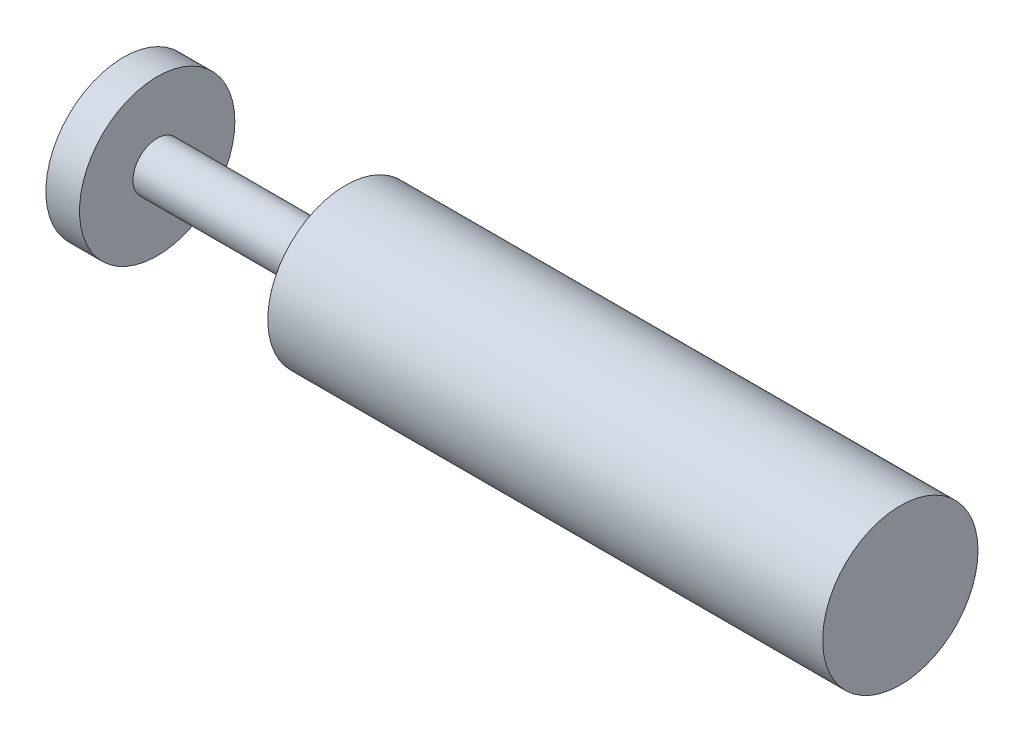
ISO-10303-21;
HEADER;
FILE_DESCRIPTION(('STEP AP214'),'2;1');
FILE_NAME('part.step','',(''),(''),'','','');
FILE_SCHEMA(('AUTOMOTIVE_DESIGN { 1 0 10303 214 1 1 1 1 }'));
ENDSEC;
DATA;
#1=APPLICATION_CONTEXT('core data for automotive mechanical design processes');
#2=APPLICATION_PROTOCOL_DEFINITION('international standard','automotive_design',2000,#1);
#3=PRODUCT_CONTEXT('',#1,'mechanical');
#4=PRODUCT('Part','Part','',(#3));
#5=PRODUCT_RELATED_PRODUCT_CATEGORY('part','',(#4));
#6=PRODUCT_DEFINITION_FORMATION('','',#4);
#7=PRODUCT_DEFINITION_CONTEXT('part definition',#1,'design');
#8=PRODUCT_DEFINITION('design','',#6,#7);
#9=PRODUCT_DEFINITION_SHAPE('','',#8);
#10=(LENGTH_UNIT() NAMED_UNIT(*) SI_UNIT(.MILLI.,.METRE.));
#11=(NAMED_UNIT(*) PLANE_ANGLE_UNIT() SI_UNIT($,.RADIAN.));
#12=(NAMED_UNIT(*) SI_UNIT($,.STERADIAN.) SOLID_ANGLE_UNIT());
#13=UNCERTAINTY_MEASURE_WITH_UNIT(LENGTH_MEASURE(1.E-05),#10,'distance_accuracy_value','');
#14=(GEOMETRIC_REPRESENTATION_CONTEXT(3) GLOBAL_UNCERTAINTY_ASSIGNED_CONTEXT((#13)) GLOBAL_UNIT_ASSIGNED_CONTEXT((#10,
#11,#12)) REPRESENTATION_CONTEXT('',''));
#15=CARTESIAN_POINT('',(0.,0.,0.));
#16=DIRECTION('',(0.,0.,1.));
#17=DIRECTION('',(1.,0.,0.));
#18=AXIS2_PLACEMENT_3D('',#15,#16,#17);
#19=CARTESIAN_POINT('',(0.,0.,0.));
#20=DIRECTION('',(-1.,0.,0.));
#21=DIRECTION('',(0.,0.,1.));
#22=AXIS2_PLACEMENT_3D('',#19,#20,#21);
#23=PLANE('',#22);
#24=CARTESIAN_POINT('',(0.,0.,0.));
#25=DIRECTION('',(1.,0.,0.));
#26=DIRECTION('',(0.,0.,-1.));
#27=AXIS2_PLACEMENT_3D('',#24,#25,#26);
#28=CIRCLE('',#27,7.);
#29=CARTESIAN_POINT('',(0.,0.,-7.));
#30=VERTEX_POINT('',#29);
#31=EDGE_CURVE('E10',#30,#30,#28,.T.);
#32=ORIENTED_EDGE('',*,*,#31,.F.);
#33=EDGE_LOOP('',(#32));
#34=FACE_BOUND('',#33,.T.);
#35=ADVANCED_FACE('F37',(#34),#23,.T.);
#36=CARTESIAN_POINT('',(70.,0.,0.));
#37=DIRECTION('',(1.,0.,0.));
#38=DIRECTION('',(0.,0.,-1.));
#39=AXIS2_PLACEMENT_3D('',#36,#37,#38);
#40=CYLINDRICAL_SURFACE('',#39,7.);
#41=ORIENTED_EDGE('',*,*,#31,.T.);
#42=EDGE_LOOP('',(#41));
#43=FACE_BOUND('',#42,.T.);
#44=CARTESIAN_POINT('',(3.03184713375797,0.,0.));
#45=DIRECTION('',(1.,0.,0.));
#46=DIRECTION('',(0.,0.,-1.));
#47=AXIS2_PLACEMENT_3D('',#44,#45,#46);
#48=CIRCLE('',#47,7.);
#49=CARTESIAN_POINT('',(3.03184713375797,0.,-7.));
#50=VERTEX_POINT('',#49);
#51=EDGE_CURVE('E44',#50,#50,#48,.T.);
#52=ORIENTED_EDGE('',*,*,#51,.F.);
#53=EDGE_LOOP('',(#52));
#54=FACE_BOUND('',#53,.T.);
#55=ADVANCED_FACE('F85',(#43,#54),#40,.T.);
#56=CARTESIAN_POINT('',(3.03184713375797,0.,-7.));
#57=DIRECTION('',(1.,0.,0.));
#58=DIRECTION('',(0.,0.,-1.));
#59=AXIS2_PLACEMENT_3D('',#56,#57,#58);
#60=PLANE('',#59);
#61=ORIENTED_EDGE('',*,*,#51,.T.);
#62=EDGE_LOOP('',(#61));
#63=FACE_BOUND('',#62,.T.);
#64=CARTESIAN_POINT('',(3.03184713375797,0.,0.));
#65=DIRECTION('',(1.,0.,0.));
#66=DIRECTION('',(0.,0.,-1.));
#67=AXIS2_PLACEMENT_3D('',#64,#65,#66);
#68=CIRCLE('',#67,2.18471337579618);
#69=CARTESIAN_POINT('',(3.03184713375797,0.,-2.18471337579618));
#70=VERTEX_POINT('',#69);
#71=EDGE_CURVE('E49',#70,#70,#68,.T.);
#72=ORIENTED_EDGE('',*,*,#71,.F.);
#73=EDGE_LOOP('',(#72));
#74=FACE_BOUND('',#73,.T.);
#75=ADVANCED_FACE('F90',(#63,#74),#60,.T.);
#76=CARTESIAN_POINT('',(70.,0.,0.));
#77=DIRECTION('',(1.,0.,0.));
#78=DIRECTION('',(0.,0.,-1.));
#79=AXIS2_PLACEMENT_3D('',#76,#77,#78);
#80=CYLINDRICAL_SURFACE('',#79,2.18471337579618);
#81=ORIENTED_EDGE('',*,*,#71,.T.);
#82=EDGE_LOOP('',(#81));
#83=FACE_BOUND('',#82,.T.);
#84=CARTESIAN_POINT('',(20.,0.,0.));
#85=DIRECTION('',(1.,0.,0.));
#86=DIRECTION('',(0.,0.,-1.));
#87=AXIS2_PLACEMENT_3D('',#84,#85,#86);
#88=CIRCLE('',#87,2.18471337579618);
#89=CARTESIAN_POINT('',(20.,0.,-2.18471337579618));
#90=VERTEX_POINT('',#89);
#91=EDGE_CURVE('E54',#90,#90,#88,.T.);
#92=ORIENTED_EDGE('',*,*,#91,.F.);
#93=EDGE_LOOP('',(#92));
#94=FACE_BOUND('',#93,.T.);
#95=ADVANCED_FACE('F81',(#83,#94),#80,.T.);
#96=CARTESIAN_POINT('',(20.,0.,-2.18471337579618));
#97=DIRECTION('',(-1.,0.,0.));
#98=DIRECTION('',(0.,0.,1.));
#99=AXIS2_PLACEMENT_3D('',#96,#97,#98);
#100=PLANE('',#99);
#101=ORIENTED_EDGE('',*,*,#91,.T.);
#102=EDGE_LOOP('',(#101));
#103=FACE_BOUND('',#102,.T.);
#104=CARTESIAN_POINT('',(20.,0.,0.));
#105=DIRECTION('',(1.,0.,0.));
#106=DIRECTION('',(0.,0.,-1.));
#107=AXIS2_PLACEMENT_3D('',#104,#105,#106);
#108=CIRCLE('',#107,7.);
#109=CARTESIAN_POINT('',(20.,0.,-7.));
#110=VERTEX_POINT('',#109);
#111=EDGE_CURVE('E60',#110,#110,#108,.T.);
#112=ORIENTED_EDGE('',*,*,#111,.F.);
#113=EDGE_LOOP('',(#112));
#114=FACE_BOUND('',#113,.T.);
#115=ADVANCED_FACE('F73',(#103,#114),#100,.T.);
#116=CARTESIAN_POINT('',(70.,0.,0.));
#117=DIRECTION('',(1.,0.,0.));
#118=DIRECTION('',(0.,0.,-1.));
#119=AXIS2_PLACEMENT_3D('',#116,#117,#118);
#120=CYLINDRICAL_SURFACE('',#119,7.);
#121=ORIENTED_EDGE('',*,*,#111,.T.);
#122=EDGE_LOOP('',(#121));
#123=FACE_BOUND('',#122,.T.);
#124=CARTESIAN_POINT('',(70.,0.,0.));
#125=DIRECTION('',(1.,0.,0.));
#126=DIRECTION('',(0.,0.,-1.));
#127=AXIS2_PLACEMENT_3D('',#124,#125,#126);
#128=CIRCLE('',#127,7.);
#129=CARTESIAN_POINT('',(70.,0.,-7.));
#130=VERTEX_POINT('',#129);
#131=EDGE_CURVE('E64',#130,#130,#128,.T.);
#132=ORIENTED_EDGE('',*,*,#131,.F.);
#133=EDGE_LOOP('',(#132));
#134=FACE_BOUND('',#133,.T.);
#135=ADVANCED_FACE('F71',(#123,#134),#120,.T.);
#136=CARTESIAN_POINT('',(70.,0.,-7.));
#137=DIRECTION('',(1.,0.,0.));
#138=DIRECTION('',(0.,0.,-1.));
#139=AXIS2_PLACEMENT_3D('',#136,#137,#138);
#140=PLANE('',#139);
#141=ORIENTED_EDGE('',*,*,#131,.T.);
#142=EDGE_LOOP('',(#141));
#143=FACE_BOUND('',#142,.T.);
#144=ADVANCED_FACE('F69',(#143),#140,.T.);
#145=CLOSED_SHELL('',(#35,#55,#75,#95,#115,#135,#144));
#146=MANIFOLD_SOLID_BREP('B2',#145);
#147=ADVANCED_BREP_SHAPE_REPRESENTATION('',(#18,#146),#14);
#148=SHAPE_DEFINITION_REPRESENTATION(#9,#147);
ENDSEC;
END-ISO-10303-21;
